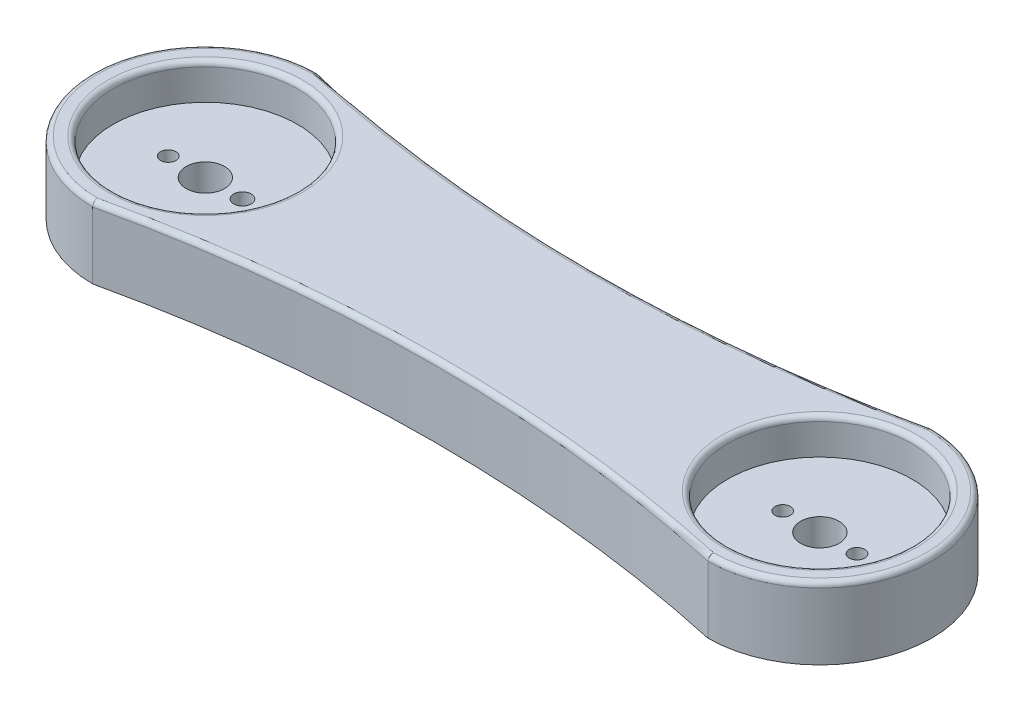
ISO-10303-21;
HEADER;
FILE_DESCRIPTION(('STEP AP214'),'2;1');
FILE_NAME('part.step','',(''),(''),'','','');
FILE_SCHEMA(('AUTOMOTIVE_DESIGN { 1 0 10303 214 1 1 1 1 }'));
ENDSEC;
DATA;
#1=APPLICATION_CONTEXT('core data for automotive mechanical design processes');
#2=APPLICATION_PROTOCOL_DEFINITION('international standard','automotive_design',2000,#1);
#3=PRODUCT_CONTEXT('',#1,'mechanical');
#4=PRODUCT('Part','Part','',(#3));
#5=PRODUCT_RELATED_PRODUCT_CATEGORY('part','',(#4));
#6=PRODUCT_DEFINITION_FORMATION('','',#4);
#7=PRODUCT_DEFINITION_CONTEXT('part definition',#1,'design');
#8=PRODUCT_DEFINITION('design','',#6,#7);
#9=PRODUCT_DEFINITION_SHAPE('','',#8);
#10=(LENGTH_UNIT() NAMED_UNIT(*) SI_UNIT(.MILLI.,.METRE.));
#11=(NAMED_UNIT(*) PLANE_ANGLE_UNIT() SI_UNIT($,.RADIAN.));
#12=(NAMED_UNIT(*) SI_UNIT($,.STERADIAN.) SOLID_ANGLE_UNIT());
#13=UNCERTAINTY_MEASURE_WITH_UNIT(LENGTH_MEASURE(1.E-05),#10,'distance_accuracy_value','');
#14=(GEOMETRIC_REPRESENTATION_CONTEXT(3) GLOBAL_UNCERTAINTY_ASSIGNED_CONTEXT((#13)) GLOBAL_UNIT_ASSIGNED_CONTEXT((#10,
#11,#12)) REPRESENTATION_CONTEXT('',''));
#15=CARTESIAN_POINT('',(0.,0.,0.));
#16=DIRECTION('',(0.,0.,1.));
#17=DIRECTION('',(1.,0.,0.));
#18=AXIS2_PLACEMENT_3D('',#15,#16,#17);
#19=CARTESIAN_POINT('',(-59.6374508906015,14.,-292.561880173553));
#20=DIRECTION('',(0.,-1.,0.));
#21=DIRECTION('',(0.,0.,-1.));
#22=AXIS2_PLACEMENT_3D('',#19,#20,#21);
#23=CYLINDRICAL_SURFACE('',#22,277.213578920717);
#24=DIRECTION('',(0.,-1.,0.));
#25=VECTOR('',#24,1.);
#26=CARTESIAN_POINT('',(-120.,14.,-22.));
#27=LINE('',#26,#25);
#28=CARTESIAN_POINT('',(-120.,13.,-22.));
#29=VERTEX_POINT('',#28);
#30=CARTESIAN_POINT('',(-120.,0.,-22.));
#31=VERTEX_POINT('',#30);
#32=EDGE_CURVE('E96',#29,#31,#27,.T.);
#33=ORIENTED_EDGE('',*,*,#32,.F.);
#34=CARTESIAN_POINT('',(-59.6374508906015,13.,-292.561880173553));
#35=DIRECTION('',(0.,-1.,0.));
#36=DIRECTION('',(0.,0.,-1.));
#37=AXIS2_PLACEMENT_3D('',#34,#35,#36);
#38=CIRCLE('',#37,277.213578920717);
#39=CARTESIAN_POINT('',(0.,13.,-21.8392494436791));
#40=VERTEX_POINT('',#39);
#41=EDGE_CURVE('E169',#29,#40,#38,.F.);
#42=ORIENTED_EDGE('',*,*,#41,.T.);
#43=DIRECTION('',(0.,-1.,0.));
#44=VECTOR('',#43,1.);
#45=CARTESIAN_POINT('',(0.,14.,-21.8392494436791));
#46=LINE('',#45,#44);
#47=CARTESIAN_POINT('',(0.,0.,-21.8392494436791));
#48=VERTEX_POINT('',#47);
#49=EDGE_CURVE('E118',#40,#48,#46,.T.);
#50=ORIENTED_EDGE('',*,*,#49,.T.);
#51=CARTESIAN_POINT('',(-59.6374508906015,0.,-292.561880173553));
#52=DIRECTION('',(0.,-1.,0.));
#53=DIRECTION('',(0.,0.,-1.));
#54=AXIS2_PLACEMENT_3D('',#51,#52,#53);
#55=CIRCLE('',#54,277.213578920717);
#56=EDGE_CURVE('E112',#48,#31,#55,.T.);
#57=ORIENTED_EDGE('',*,*,#56,.T.);
#58=EDGE_LOOP('',(#33,#42,#50,#57));
#59=FACE_BOUND('',#58,.T.);
#60=ADVANCED_FACE('F39',(#59),#23,.F.);
#61=CARTESIAN_POINT('',(-120.,14.,0.));
#62=DIRECTION('',(0.,-1.,0.));
#63=DIRECTION('',(0.,0.,-1.));
#64=AXIS2_PLACEMENT_3D('',#61,#62,#63);
#65=CYLINDRICAL_SURFACE('',#64,22.);
#66=DIRECTION('',(0.,-1.,0.));
#67=VECTOR('',#66,1.);
#68=CARTESIAN_POINT('',(-120.,14.,22.));
#69=LINE('',#68,#67);
#70=CARTESIAN_POINT('',(-120.,13.,22.));
#71=VERTEX_POINT('',#70);
#72=CARTESIAN_POINT('',(-120.,0.,22.));
#73=VERTEX_POINT('',#72);
#74=EDGE_CURVE('E106',#71,#73,#69,.T.);
#75=ORIENTED_EDGE('',*,*,#74,.F.);
#76=CARTESIAN_POINT('',(-120.,13.,0.));
#77=DIRECTION('',(0.,-1.,0.));
#78=DIRECTION('',(0.,0.,-1.));
#79=AXIS2_PLACEMENT_3D('',#76,#77,#78);
#80=CIRCLE('',#79,22.);
#81=EDGE_CURVE('E54',#71,#29,#80,.T.);
#82=ORIENTED_EDGE('',*,*,#81,.T.);
#83=ORIENTED_EDGE('',*,*,#32,.T.);
#84=CARTESIAN_POINT('',(-120.,0.,0.));
#85=DIRECTION('',(0.,1.,0.));
#86=DIRECTION('',(0.,0.,1.));
#87=AXIS2_PLACEMENT_3D('',#84,#85,#86);
#88=CIRCLE('',#87,22.);
#89=EDGE_CURVE('E99',#31,#73,#88,.T.);
#90=ORIENTED_EDGE('',*,*,#89,.T.);
#91=EDGE_LOOP('',(#75,#82,#83,#90));
#92=FACE_BOUND('',#91,.T.);
#93=ADVANCED_FACE('F98',(#92),#65,.T.);
#94=CARTESIAN_POINT('',(-59.6374505493174,14.,292.562134941562));
#95=DIRECTION('',(0.,-1.,0.));
#96=DIRECTION('',(0.,0.,-1.));
#97=AXIS2_PLACEMENT_3D('',#94,#95,#96);
#98=CYLINDRICAL_SURFACE('',#97,277.213827649925);
#99=DIRECTION('',(0.,-1.,0.));
#100=VECTOR('',#99,1.);
#101=CARTESIAN_POINT('',(0.,14.,21.8392494436791));
#102=LINE('',#101,#100);
#103=CARTESIAN_POINT('',(0.,13.,21.8392494436791));
#104=VERTEX_POINT('',#103);
#105=CARTESIAN_POINT('',(0.,0.,21.8392494436791));
#106=VERTEX_POINT('',#105);
#107=EDGE_CURVE('E136',#104,#106,#102,.T.);
#108=ORIENTED_EDGE('',*,*,#107,.F.);
#109=CARTESIAN_POINT('',(-59.6374505493174,13.,292.562134941562));
#110=DIRECTION('',(0.,-1.,0.));
#111=DIRECTION('',(0.,0.,-1.));
#112=AXIS2_PLACEMENT_3D('',#109,#110,#111);
#113=CIRCLE('',#112,277.213827649925);
#114=EDGE_CURVE('E11',#104,#71,#113,.F.);
#115=ORIENTED_EDGE('',*,*,#114,.T.);
#116=ORIENTED_EDGE('',*,*,#74,.T.);
#117=CARTESIAN_POINT('',(-59.6374505493174,0.,292.562134941562));
#118=DIRECTION('',(0.,-1.,0.));
#119=DIRECTION('',(0.,0.,1.));
#120=AXIS2_PLACEMENT_3D('',#117,#118,#119);
#121=CIRCLE('',#120,277.213827649925);
#122=EDGE_CURVE('E114',#73,#106,#121,.T.);
#123=ORIENTED_EDGE('',*,*,#122,.T.);
#124=EDGE_LOOP('',(#108,#115,#116,#123));
#125=FACE_BOUND('',#124,.T.);
#126=ADVANCED_FACE('F227',(#125),#98,.F.);
#127=CARTESIAN_POINT('',(0.,14.,0.));
#128=DIRECTION('',(0.,-1.,0.));
#129=DIRECTION('',(0.,0.,-1.));
#130=AXIS2_PLACEMENT_3D('',#127,#128,#129);
#131=CYLINDRICAL_SURFACE('',#130,21.8392494436791);
#132=ORIENTED_EDGE('',*,*,#49,.F.);
#133=CARTESIAN_POINT('',(0.,13.,0.));
#134=DIRECTION('',(0.,-1.,0.));
#135=DIRECTION('',(0.,0.,-1.));
#136=AXIS2_PLACEMENT_3D('',#133,#134,#135);
#137=CIRCLE('',#136,21.8392494436791);
#138=EDGE_CURVE('E165',#40,#104,#137,.T.);
#139=ORIENTED_EDGE('',*,*,#138,.T.);
#140=ORIENTED_EDGE('',*,*,#107,.T.);
#141=CARTESIAN_POINT('',(0.,0.,0.));
#142=DIRECTION('',(0.,1.,0.));
#143=DIRECTION('',(0.,0.,1.));
#144=AXIS2_PLACEMENT_3D('',#141,#142,#143);
#145=CIRCLE('',#144,21.8392494436791);
#146=EDGE_CURVE('E131',#106,#48,#145,.T.);
#147=ORIENTED_EDGE('',*,*,#146,.T.);
#148=EDGE_LOOP('',(#132,#139,#140,#147));
#149=FACE_BOUND('',#148,.T.);
#150=ADVANCED_FACE('F232',(#149),#131,.T.);
#151=CARTESIAN_POINT('',(-89.8187254453008,14.,-146.280940086777));
#152=DIRECTION('',(0.,-1.,0.));
#153=DIRECTION('',(0.,0.,-1.));
#154=AXIS2_PLACEMENT_3D('',#151,#152,#153);
#155=PLANE('',#154);
#156=CARTESIAN_POINT('',(0.,14.,0.));
#157=DIRECTION('',(0.,-1.,0.));
#158=DIRECTION('',(0.,0.,-1.));
#159=AXIS2_PLACEMENT_3D('',#156,#157,#158);
#160=CIRCLE('',#159,19.);
#161=CARTESIAN_POINT('',(0.,14.,-19.));
#162=VERTEX_POINT('',#161);
#163=EDGE_CURVE('E161',#162,#162,#160,.T.);
#164=ORIENTED_EDGE('',*,*,#163,.T.);
#165=EDGE_LOOP('',(#164));
#166=FACE_BOUND('',#165,.T.);
#167=CARTESIAN_POINT('',(-120.,14.,0.));
#168=DIRECTION('',(0.,-1.,0.));
#169=DIRECTION('',(0.,0.,-1.));
#170=AXIS2_PLACEMENT_3D('',#167,#168,#169);
#171=CIRCLE('',#170,19.);
#172=CARTESIAN_POINT('',(-120.,14.,-19.));
#173=VERTEX_POINT('',#172);
#174=EDGE_CURVE('E157',#173,#173,#171,.T.);
#175=ORIENTED_EDGE('',*,*,#174,.T.);
#176=EDGE_LOOP('',(#175));
#177=FACE_BOUND('',#176,.T.);
#178=CARTESIAN_POINT('',(-59.6374505493174,14.,292.562134941562));
#179=DIRECTION('',(0.,-1.,0.));
#180=DIRECTION('',(0.,0.,-1.));
#181=AXIS2_PLACEMENT_3D('',#178,#179,#180);
#182=CIRCLE('',#181,278.213827649925);
#183=CARTESIAN_POINT('',(-120.108828926809,14.,20.9997180044088));
#184=VERTEX_POINT('',#183);
#185=CARTESIAN_POINT('',(0.10748031950056,14.,20.8389722720867));
#186=VERTEX_POINT('',#185);
#187=EDGE_CURVE('E144',#184,#186,#182,.T.);
#188=ORIENTED_EDGE('',*,*,#187,.T.);
#189=CARTESIAN_POINT('',(0.,14.,0.));
#190=DIRECTION('',(0.,-1.,0.));
#191=DIRECTION('',(0.,0.,-1.));
#192=AXIS2_PLACEMENT_3D('',#189,#190,#191);
#193=CIRCLE('',#192,20.8392494436791);
#194=CARTESIAN_POINT('',(0.107480418815562,14.,-20.8389722715745));
#195=VERTEX_POINT('',#194);
#196=EDGE_CURVE('E153',#186,#195,#193,.F.);
#197=ORIENTED_EDGE('',*,*,#196,.T.);
#198=CARTESIAN_POINT('',(-59.6374508906015,14.,-292.561880173553));
#199=DIRECTION('',(0.,-1.,0.));
#200=DIRECTION('',(0.,0.,-1.));
#201=AXIS2_PLACEMENT_3D('',#198,#199,#200);
#202=CIRCLE('',#201,278.213578920717);
#203=CARTESIAN_POINT('',(-120.108829026161,14.,-20.9997180038939));
#204=VERTEX_POINT('',#203);
#205=EDGE_CURVE('E150',#195,#204,#202,.T.);
#206=ORIENTED_EDGE('',*,*,#205,.T.);
#207=CARTESIAN_POINT('',(-120.,14.,0.));
#208=DIRECTION('',(0.,-1.,0.));
#209=DIRECTION('',(0.,0.,-1.));
#210=AXIS2_PLACEMENT_3D('',#207,#208,#209);
#211=CIRCLE('',#210,21.);
#212=EDGE_CURVE('E147',#204,#184,#211,.F.);
#213=ORIENTED_EDGE('',*,*,#212,.T.);
#214=EDGE_LOOP('',(#188,#197,#206,#213));
#215=FACE_BOUND('',#214,.T.);
#216=ADVANCED_FACE('F235',(#166,#177,#215),#155,.F.);
#217=CARTESIAN_POINT('',(-89.8187254453008,0.,-146.280940086777));
#218=DIRECTION('',(0.,-1.,0.));
#219=DIRECTION('',(0.,0.,-1.));
#220=AXIS2_PLACEMENT_3D('',#217,#218,#219);
#221=PLANE('',#220);
#222=CARTESIAN_POINT('',(-7.25,0.,0.));
#223=DIRECTION('',(0.,1.,0.));
#224=DIRECTION('',(0.,0.,1.));
#225=AXIS2_PLACEMENT_3D('',#222,#223,#224);
#226=CIRCLE('',#225,1.5);
#227=CARTESIAN_POINT('',(-7.25,0.,1.5));
#228=VERTEX_POINT('',#227);
#229=EDGE_CURVE('E292',#228,#228,#226,.T.);
#230=ORIENTED_EDGE('',*,*,#229,.T.);
#231=EDGE_LOOP('',(#230));
#232=FACE_BOUND('',#231,.T.);
#233=CARTESIAN_POINT('',(7.25,0.,0.));
#234=DIRECTION('',(0.,1.,0.));
#235=DIRECTION('',(0.,0.,1.));
#236=AXIS2_PLACEMENT_3D('',#233,#234,#235);
#237=CIRCLE('',#236,1.5);
#238=CARTESIAN_POINT('',(7.25,0.,1.5));
#239=VERTEX_POINT('',#238);
#240=EDGE_CURVE('E286',#239,#239,#237,.T.);
#241=ORIENTED_EDGE('',*,*,#240,.T.);
#242=EDGE_LOOP('',(#241));
#243=FACE_BOUND('',#242,.T.);
#244=CARTESIAN_POINT('',(0.,0.,0.));
#245=DIRECTION('',(0.,1.,0.));
#246=DIRECTION('',(0.,0.,1.));
#247=AXIS2_PLACEMENT_3D('',#244,#245,#246);
#248=CIRCLE('',#247,3.75);
#249=CARTESIAN_POINT('',(0.,0.,3.75));
#250=VERTEX_POINT('',#249);
#251=EDGE_CURVE('E305',#250,#250,#248,.T.);
#252=ORIENTED_EDGE('',*,*,#251,.T.);
#253=EDGE_LOOP('',(#252));
#254=FACE_BOUND('',#253,.T.);
#255=CARTESIAN_POINT('',(-112.75,0.,0.));
#256=DIRECTION('',(0.,1.,0.));
#257=DIRECTION('',(0.,0.,1.));
#258=AXIS2_PLACEMENT_3D('',#255,#256,#257);
#259=CIRCLE('',#258,1.70242679062383);
#260=CARTESIAN_POINT('',(-112.75,0.,1.70242679062383));
#261=VERTEX_POINT('',#260);
#262=EDGE_CURVE('E322',#261,#261,#259,.T.);
#263=ORIENTED_EDGE('',*,*,#262,.T.);
#264=EDGE_LOOP('',(#263));
#265=FACE_BOUND('',#264,.T.);
#266=CARTESIAN_POINT('',(-127.25,0.,0.));
#267=DIRECTION('',(0.,1.,0.));
#268=DIRECTION('',(0.,0.,1.));
#269=AXIS2_PLACEMENT_3D('',#266,#267,#268);
#270=CIRCLE('',#269,1.5);
#271=CARTESIAN_POINT('',(-127.25,0.,1.5));
#272=VERTEX_POINT('',#271);
#273=EDGE_CURVE('E313',#272,#272,#270,.T.);
#274=ORIENTED_EDGE('',*,*,#273,.T.);
#275=EDGE_LOOP('',(#274));
#276=FACE_BOUND('',#275,.T.);
#277=CARTESIAN_POINT('',(-120.,0.,0.));
#278=DIRECTION('',(0.,1.,0.));
#279=DIRECTION('',(0.,0.,1.));
#280=AXIS2_PLACEMENT_3D('',#277,#278,#279);
#281=CIRCLE('',#280,3.75000000000001);
#282=CARTESIAN_POINT('',(-120.,0.,3.75000000000001));
#283=VERTEX_POINT('',#282);
#284=EDGE_CURVE('E329',#283,#283,#281,.T.);
#285=ORIENTED_EDGE('',*,*,#284,.T.);
#286=EDGE_LOOP('',(#285));
#287=FACE_BOUND('',#286,.T.);
#288=ORIENTED_EDGE('',*,*,#56,.F.);
#289=ORIENTED_EDGE('',*,*,#146,.F.);
#290=ORIENTED_EDGE('',*,*,#122,.F.);
#291=ORIENTED_EDGE('',*,*,#89,.F.);
#292=EDGE_LOOP('',(#288,#289,#290,#291));
#293=FACE_BOUND('',#292,.T.);
#294=ADVANCED_FACE('F110',(#232,#243,#254,#265,#276,#287,#293),#221,.T.);
#295=CARTESIAN_POINT('',(0.,7.,0.));
#296=DIRECTION('',(0.,1.,0.));
#297=DIRECTION('',(0.,0.,1.));
#298=AXIS2_PLACEMENT_3D('',#295,#296,#297);
#299=CYLINDRICAL_SURFACE('',#298,18.);
#300=CARTESIAN_POINT('',(0.,13.,0.));
#301=DIRECTION('',(0.,-1.,0.));
#302=DIRECTION('',(0.,0.,-1.));
#303=AXIS2_PLACEMENT_3D('',#300,#301,#302);
#304=CIRCLE('',#303,18.);
#305=CARTESIAN_POINT('',(0.,13.,-18.));
#306=VERTEX_POINT('',#305);
#307=EDGE_CURVE('E105',#306,#306,#304,.F.);
#308=ORIENTED_EDGE('',*,*,#307,.T.);
#309=EDGE_LOOP('',(#308));
#310=FACE_BOUND('',#309,.T.);
#311=CARTESIAN_POINT('',(0.,7.,0.));
#312=DIRECTION('',(0.,1.,0.));
#313=DIRECTION('',(0.,0.,1.));
#314=AXIS2_PLACEMENT_3D('',#311,#312,#313);
#315=CIRCLE('',#314,18.);
#316=CARTESIAN_POINT('',(0.,7.,18.));
#317=VERTEX_POINT('',#316);
#318=EDGE_CURVE('E125',#317,#317,#315,.T.);
#319=ORIENTED_EDGE('',*,*,#318,.F.);
#320=EDGE_LOOP('',(#319));
#321=FACE_BOUND('',#320,.T.);
#322=ADVANCED_FACE('F239',(#310,#321),#299,.F.);
#323=CARTESIAN_POINT('',(0.,7.,0.));
#324=DIRECTION('',(0.,1.,0.));
#325=DIRECTION('',(0.,0.,1.));
#326=AXIS2_PLACEMENT_3D('',#323,#324,#325);
#327=PLANE('',#326);
#328=CARTESIAN_POINT('',(0.,7.,0.));
#329=DIRECTION('',(0.,1.,0.));
#330=DIRECTION('',(0.,0.,1.));
#331=AXIS2_PLACEMENT_3D('',#328,#329,#330);
#332=CIRCLE('',#331,3.75);
#333=CARTESIAN_POINT('',(0.,7.,3.75));
#334=VERTEX_POINT('',#333);
#335=EDGE_CURVE('E296',#334,#334,#332,.T.);
#336=ORIENTED_EDGE('',*,*,#335,.F.);
#337=EDGE_LOOP('',(#336));
#338=FACE_BOUND('',#337,.T.);
#339=CARTESIAN_POINT('',(-7.25,7.,0.));
#340=DIRECTION('',(0.,1.,0.));
#341=DIRECTION('',(0.,0.,1.));
#342=AXIS2_PLACEMENT_3D('',#339,#340,#341);
#343=CIRCLE('',#342,1.5);
#344=CARTESIAN_POINT('',(-7.25,7.,1.5));
#345=VERTEX_POINT('',#344);
#346=EDGE_CURVE('E299',#345,#345,#343,.T.);
#347=ORIENTED_EDGE('',*,*,#346,.F.);
#348=EDGE_LOOP('',(#347));
#349=FACE_BOUND('',#348,.T.);
#350=CARTESIAN_POINT('',(7.25,7.,0.));
#351=DIRECTION('',(0.,1.,0.));
#352=DIRECTION('',(0.,0.,1.));
#353=AXIS2_PLACEMENT_3D('',#350,#351,#352);
#354=CIRCLE('',#353,1.5);
#355=CARTESIAN_POINT('',(7.25,7.,1.5));
#356=VERTEX_POINT('',#355);
#357=EDGE_CURVE('E289',#356,#356,#354,.T.);
#358=ORIENTED_EDGE('',*,*,#357,.F.);
#359=EDGE_LOOP('',(#358));
#360=FACE_BOUND('',#359,.T.);
#361=ORIENTED_EDGE('',*,*,#318,.T.);
#362=EDGE_LOOP('',(#361));
#363=FACE_BOUND('',#362,.T.);
#364=ADVANCED_FACE('F246',(#338,#349,#360,#363),#327,.T.);
#365=CARTESIAN_POINT('',(-120.,7.,0.));
#366=DIRECTION('',(0.,1.,0.));
#367=DIRECTION('',(0.,0.,1.));
#368=AXIS2_PLACEMENT_3D('',#365,#366,#367);
#369=CYLINDRICAL_SURFACE('',#368,18.);
#370=CARTESIAN_POINT('',(-120.,13.,0.));
#371=DIRECTION('',(0.,-1.,0.));
#372=DIRECTION('',(0.,0.,-1.));
#373=AXIS2_PLACEMENT_3D('',#370,#371,#372);
#374=CIRCLE('',#373,18.);
#375=CARTESIAN_POINT('',(-120.,13.,-18.));
#376=VERTEX_POINT('',#375);
#377=EDGE_CURVE('E172',#376,#376,#374,.F.);
#378=ORIENTED_EDGE('',*,*,#377,.T.);
#379=EDGE_LOOP('',(#378));
#380=FACE_BOUND('',#379,.T.);
#381=CARTESIAN_POINT('',(-120.,7.,0.));
#382=DIRECTION('',(0.,1.,0.));
#383=DIRECTION('',(0.,0.,1.));
#384=AXIS2_PLACEMENT_3D('',#381,#382,#383);
#385=CIRCLE('',#384,18.);
#386=CARTESIAN_POINT('',(-120.,7.,18.));
#387=VERTEX_POINT('',#386);
#388=EDGE_CURVE('E121',#387,#387,#385,.T.);
#389=ORIENTED_EDGE('',*,*,#388,.F.);
#390=EDGE_LOOP('',(#389));
#391=FACE_BOUND('',#390,.T.);
#392=ADVANCED_FACE('F250',(#380,#391),#369,.F.);
#393=CARTESIAN_POINT('',(-120.,7.,0.));
#394=DIRECTION('',(0.,1.,0.));
#395=DIRECTION('',(0.,0.,1.));
#396=AXIS2_PLACEMENT_3D('',#393,#394,#395);
#397=PLANE('',#396);
#398=CARTESIAN_POINT('',(-120.,7.,0.));
#399=DIRECTION('',(0.,1.,0.));
#400=DIRECTION('',(0.,0.,1.));
#401=AXIS2_PLACEMENT_3D('',#398,#399,#400);
#402=CIRCLE('',#401,3.75000000000001);
#403=CARTESIAN_POINT('',(-120.,7.,3.75000000000001));
#404=VERTEX_POINT('',#403);
#405=EDGE_CURVE('E317',#404,#404,#402,.T.);
#406=ORIENTED_EDGE('',*,*,#405,.F.);
#407=EDGE_LOOP('',(#406));
#408=FACE_BOUND('',#407,.T.);
#409=CARTESIAN_POINT('',(-112.75,7.,0.));
#410=DIRECTION('',(0.,1.,0.));
#411=DIRECTION('',(0.,0.,1.));
#412=AXIS2_PLACEMENT_3D('',#409,#410,#411);
#413=CIRCLE('',#412,1.70242679062383);
#414=CARTESIAN_POINT('',(-112.75,7.,1.70242679062383));
#415=VERTEX_POINT('',#414);
#416=EDGE_CURVE('E309',#415,#415,#413,.T.);
#417=ORIENTED_EDGE('',*,*,#416,.F.);
#418=EDGE_LOOP('',(#417));
#419=FACE_BOUND('',#418,.T.);
#420=CARTESIAN_POINT('',(-127.25,7.,0.));
#421=DIRECTION('',(0.,1.,0.));
#422=DIRECTION('',(0.,0.,1.));
#423=AXIS2_PLACEMENT_3D('',#420,#421,#422);
#424=CIRCLE('',#423,1.5);
#425=CARTESIAN_POINT('',(-127.25,7.,1.5));
#426=VERTEX_POINT('',#425);
#427=EDGE_CURVE('E318',#426,#426,#424,.T.);
#428=ORIENTED_EDGE('',*,*,#427,.F.);
#429=EDGE_LOOP('',(#428));
#430=FACE_BOUND('',#429,.T.);
#431=ORIENTED_EDGE('',*,*,#388,.T.);
#432=EDGE_LOOP('',(#431));
#433=FACE_BOUND('',#432,.T.);
#434=ADVANCED_FACE('F254',(#408,#419,#430,#433),#397,.T.);
#435=CARTESIAN_POINT('',(-127.25,0.,0.));
#436=DIRECTION('',(0.,1.,0.));
#437=DIRECTION('',(0.,0.,1.));
#438=AXIS2_PLACEMENT_3D('',#435,#436,#437);
#439=CYLINDRICAL_SURFACE('',#438,1.5);
#440=ORIENTED_EDGE('',*,*,#273,.F.);
#441=EDGE_LOOP('',(#440));
#442=FACE_BOUND('',#441,.T.);
#443=ORIENTED_EDGE('',*,*,#427,.T.);
#444=EDGE_LOOP('',(#443));
#445=FACE_BOUND('',#444,.T.);
#446=ADVANCED_FACE('F258',(#442,#445),#439,.F.);
#447=CARTESIAN_POINT('',(-112.75,0.,0.));
#448=DIRECTION('',(0.,1.,0.));
#449=DIRECTION('',(0.,0.,1.));
#450=AXIS2_PLACEMENT_3D('',#447,#448,#449);
#451=CYLINDRICAL_SURFACE('',#450,1.70242679062383);
#452=ORIENTED_EDGE('',*,*,#262,.F.);
#453=EDGE_LOOP('',(#452));
#454=FACE_BOUND('',#453,.T.);
#455=ORIENTED_EDGE('',*,*,#416,.T.);
#456=EDGE_LOOP('',(#455));
#457=FACE_BOUND('',#456,.T.);
#458=ADVANCED_FACE('F264',(#454,#457),#451,.F.);
#459=CARTESIAN_POINT('',(-120.,0.,0.));
#460=DIRECTION('',(0.,1.,0.));
#461=DIRECTION('',(0.,0.,1.));
#462=AXIS2_PLACEMENT_3D('',#459,#460,#461);
#463=CYLINDRICAL_SURFACE('',#462,3.75000000000001);
#464=ORIENTED_EDGE('',*,*,#284,.F.);
#465=EDGE_LOOP('',(#464));
#466=FACE_BOUND('',#465,.T.);
#467=ORIENTED_EDGE('',*,*,#405,.T.);
#468=EDGE_LOOP('',(#467));
#469=FACE_BOUND('',#468,.T.);
#470=ADVANCED_FACE('F260',(#466,#469),#463,.F.);
#471=CARTESIAN_POINT('',(7.25,0.,0.));
#472=DIRECTION('',(0.,1.,0.));
#473=DIRECTION('',(0.,0.,1.));
#474=AXIS2_PLACEMENT_3D('',#471,#472,#473);
#475=CYLINDRICAL_SURFACE('',#474,1.5);
#476=ORIENTED_EDGE('',*,*,#240,.F.);
#477=EDGE_LOOP('',(#476));
#478=FACE_BOUND('',#477,.T.);
#479=ORIENTED_EDGE('',*,*,#357,.T.);
#480=EDGE_LOOP('',(#479));
#481=FACE_BOUND('',#480,.T.);
#482=ADVANCED_FACE('F263',(#478,#481),#475,.F.);
#483=CARTESIAN_POINT('',(-7.25,0.,0.));
#484=DIRECTION('',(0.,1.,0.));
#485=DIRECTION('',(0.,0.,1.));
#486=AXIS2_PLACEMENT_3D('',#483,#484,#485);
#487=CYLINDRICAL_SURFACE('',#486,1.5);
#488=ORIENTED_EDGE('',*,*,#229,.F.);
#489=EDGE_LOOP('',(#488));
#490=FACE_BOUND('',#489,.T.);
#491=ORIENTED_EDGE('',*,*,#346,.T.);
#492=EDGE_LOOP('',(#491));
#493=FACE_BOUND('',#492,.T.);
#494=ADVANCED_FACE('F274',(#490,#493),#487,.F.);
#495=CARTESIAN_POINT('',(0.,0.,0.));
#496=DIRECTION('',(0.,1.,0.));
#497=DIRECTION('',(0.,0.,1.));
#498=AXIS2_PLACEMENT_3D('',#495,#496,#497);
#499=CYLINDRICAL_SURFACE('',#498,3.75);
#500=ORIENTED_EDGE('',*,*,#251,.F.);
#501=EDGE_LOOP('',(#500));
#502=FACE_BOUND('',#501,.T.);
#503=ORIENTED_EDGE('',*,*,#335,.T.);
#504=EDGE_LOOP('',(#503));
#505=FACE_BOUND('',#504,.T.);
#506=ADVANCED_FACE('F220',(#502,#505),#499,.F.);
#507=CARTESIAN_POINT('',(0.,13.,0.));
#508=DIRECTION('',(0.,-1.,0.));
#509=DIRECTION('',(0.,0.,-1.));
#510=AXIS2_PLACEMENT_3D('',#507,#508,#509);
#511=TOROIDAL_SURFACE('',#510,19.,1.);
#512=ORIENTED_EDGE('',*,*,#163,.F.);
#513=EDGE_LOOP('',(#512));
#514=FACE_BOUND('',#513,.T.);
#515=ORIENTED_EDGE('',*,*,#307,.F.);
#516=EDGE_LOOP('',(#515));
#517=FACE_BOUND('',#516,.T.);
#518=ADVANCED_FACE('F212',(#514,#517),#511,.T.);
#519=CARTESIAN_POINT('',(-120.,13.,0.));
#520=DIRECTION('',(0.,-1.,0.));
#521=DIRECTION('',(0.,0.,-1.));
#522=AXIS2_PLACEMENT_3D('',#519,#520,#521);
#523=TOROIDAL_SURFACE('',#522,21.,1.);
#524=CARTESIAN_POINT('',(-120.,13.,-22.));
#525=CARTESIAN_POINT('',(-119.999999992669,13.0280100744811,-21.9999998989799));
#526=CARTESIAN_POINT('',(-120.000129767721,13.0560066871765,-21.9988224077833));
#527=CARTESIAN_POINT('',(-120.000647309818,13.111798659349,-21.9941254937511));
#528=CARTESIAN_POINT('',(-120.001035061478,13.1395940307283,-21.990606210581));
#529=CARTESIAN_POINT('',(-120.002581139866,13.2223252047846,-21.9765711265597));
#530=CARTESIAN_POINT('',(-120.004122302503,13.2767053093904,-21.9625779871342));
#531=CARTESIAN_POINT('',(-120.008178186036,13.3823259483589,-21.9257205315833));
#532=CARTESIAN_POINT('',(-120.010693314246,13.4335651588001,-21.9028525039666));
#533=CARTESIAN_POINT('',(-120.016618684787,13.5314650391127,-21.8489142759279));
#534=CARTESIAN_POINT('',(-120.020028759968,13.5781265617282,-21.8178456071384));
#535=CARTESIAN_POINT('',(-120.02764957964,13.6656862458729,-21.7483114744114));
#536=CARTESIAN_POINT('',(-120.031862361292,13.7065692723083,-21.7098271877597));
#537=CARTESIAN_POINT('',(-120.040957208881,13.781313994956,-21.6266008322268));
#538=CARTESIAN_POINT('',(-120.045839499451,13.8151733249446,-21.5818566629172));
#539=CARTESIAN_POINT('',(-120.056157420414,13.875106315563,-21.4871132346009));
#540=CARTESIAN_POINT('',(-120.061596174993,13.9011323756857,-21.4370842474231));
#541=CARTESIAN_POINT('',(-120.072841378288,13.9444006748518,-21.3334234626747));
#542=CARTESIAN_POINT('',(-120.078647541968,13.9616496314718,-21.2797944560804));
#543=CARTESIAN_POINT('',(-120.08830909902,13.9823308299657,-21.190355318359));
#544=CARTESIAN_POINT('',(-120.092107327885,13.9885057880401,-21.1551456437249));
#545=CARTESIAN_POINT('',(-120.099737937603,13.9970554082015,-21.0843077229753));
#546=CARTESIAN_POINT('',(-120.103570254326,13.9994361156593,-21.0486802340005));
#547=CARTESIAN_POINT('',(-120.107874496479,13.9999704677244,-21.0086072156643));
#548=CARTESIAN_POINT('',(-120.108351828867,14.0000000779001,-21.0041623861088));
#549=CARTESIAN_POINT('',(-120.108829026161,14.,-20.9997180038939));
#550=B_SPLINE_CURVE_WITH_KNOTS('',3,(#524,#525,#526,#527,#528,#529,#530,#531,#532,#533,#534,
#535,#536,#537,#538,#539,#540,#541,#542,#543,#544,#545,#546,#547,#548,#549),.UNSPECIFIED.,.F.,
.F.,(4,2,2,2,2,2,2,2,2,2,2,2,4),(0.,0.0839784653931065,0.167951922719227,0.335604911211167,
0.503328088113528,0.671019961525235,0.839143223753665,1.00732303361971,1.17650509616808,
1.34555747933594,1.45322729743761,1.56072539334331,1.57413638594396),.UNSPECIFIED.);
#551=EDGE_CURVE('E202',#29,#204,#550,.T.);
#552=ORIENTED_EDGE('',*,*,#551,.F.);
#553=ORIENTED_EDGE('',*,*,#81,.F.);
#554=CARTESIAN_POINT('',(-120.,13.,22.));
#555=CARTESIAN_POINT('',(-119.999999992669,13.0280100747049,21.9999998989797));
#556=CARTESIAN_POINT('',(-120.000129767604,13.0560066876241,21.9988224077645));
#557=CARTESIAN_POINT('',(-120.000647309237,13.1117986602442,21.9941254936569));
#558=CARTESIAN_POINT('',(-120.001035060549,13.1395940318473,21.99060621043));
#559=CARTESIAN_POINT('',(-120.00258113755,13.2223252065898,21.9765711261766));
#560=CARTESIAN_POINT('',(-120.004122298805,13.276705311656,21.9625779865144));
#561=CARTESIAN_POINT('',(-120.008178178705,13.3823259515291,21.9257205303091));
#562=CARTESIAN_POINT('',(-120.010693304664,13.4335651624141,21.9028525022736));
#563=CARTESIAN_POINT('',(-120.016618669907,13.5314650435514,21.8489142732001));
#564=CARTESIAN_POINT('',(-120.020028742041,13.5781265665481,21.8178456037952));
#565=CARTESIAN_POINT('',(-120.027649554894,13.6656862511343,21.7483114697949));
#566=CARTESIAN_POINT('',(-120.031862332768,13.7065692776578,21.7098271825194));
#567=CARTESIAN_POINT('',(-120.040957172206,13.7813140003665,21.6266008255979));
#568=CARTESIAN_POINT('',(-120.045839458403,13.8151733303281,21.5818566555236));
#569=CARTESIAN_POINT('',(-120.056157370075,13.8751063204023,21.4871132260481));
#570=CARTESIAN_POINT('',(-120.061596119728,13.901132380089,21.4370842385265));
#571=CARTESIAN_POINT('',(-120.072841312836,13.9444006783195,21.333423453103));
#572=CARTESIAN_POINT('',(-120.078647471256,13.9616496344422,21.2797944461784));
#573=CARTESIAN_POINT('',(-120.088309019237,13.9823308313825,21.1903553108553));
#574=CARTESIAN_POINT('',(-120.092107244338,13.9885057887377,21.1551456390015));
#575=CARTESIAN_POINT('',(-120.099737846494,13.9970554080611,21.0843077238796));
#576=CARTESIAN_POINT('',(-120.103570159418,13.9994361153988,21.048680237752));
#577=CARTESIAN_POINT('',(-120.107874397562,13.9999704676974,21.0086072202252));
#578=CARTESIAN_POINT('',(-120.108351729732,14.0000000779002,21.0041623886465));
#579=CARTESIAN_POINT('',(-120.108828926809,14.,20.9997180044088));
#580=B_SPLINE_CURVE_WITH_KNOTS('',3,(#554,#555,#556,#557,#558,#559,#560,#561,#562,#563,#564,
#565,#566,#567,#568,#569,#570,#571,#572,#573,#574,#575,#576,#577,#578,#579),.UNSPECIFIED.,.F.,
.F.,(4,2,2,2,2,2,2,2,2,2,2,2,4),(0.,0.0839784660643416,0.167951924063463,0.335604913950104,
0.503328092265551,0.671019967074645,0.839143229911598,1.00732304038771,1.17650510182246,
1.34555748383363,1.45322729224546,1.56072537849313,1.5741363770587),.UNSPECIFIED.);
#581=EDGE_CURVE('E43',#184,#71,#580,.F.);
#582=ORIENTED_EDGE('',*,*,#581,.F.);
#583=ORIENTED_EDGE('',*,*,#212,.F.);
#584=EDGE_LOOP('',(#552,#553,#582,#583));
#585=FACE_BOUND('',#584,.T.);
#586=ADVANCED_FACE('F209',(#585),#523,.T.);
#587=CARTESIAN_POINT('',(-59.6374505493174,13.,292.562134941562));
#588=DIRECTION('',(0.,-1.,0.));
#589=DIRECTION('',(0.,0.,-1.));
#590=AXIS2_PLACEMENT_3D('',#587,#588,#589);
#591=TOROIDAL_SURFACE('',#590,278.213827649925,1.);
#592=ORIENTED_EDGE('',*,*,#581,.T.);
#593=ORIENTED_EDGE('',*,*,#114,.F.);
#594=CARTESIAN_POINT('',(0.,13.,21.8392494436791));
#595=CARTESIAN_POINT('',(-7.13659848519394E-09,13.0280130654566,21.839249340542));
#596=CARTESIAN_POINT('',(0.000128198537886458,13.0560126687267,21.838071600135));
#597=CARTESIAN_POINT('',(0.000639482720950815,13.1118106233858,21.8333736777814));
#598=CARTESIAN_POINT('',(0.00102254610313931,13.1396089866198,21.8298536348559));
#599=CARTESIAN_POINT('',(0.002549936884094,13.2223493327067,21.8158154484639));
#600=CARTESIAN_POINT('',(0.0040724772269832,13.276735592741,21.8018191436921));
#601=CARTESIAN_POINT('',(0.00807937470590087,13.3823683265668,21.7649529303695));
#602=CARTESIAN_POINT('',(0.0105641356144463,13.4336134717955,21.7420792966543));
#603=CARTESIAN_POINT('',(0.0164179859894211,13.5315243758918,21.6881272065098));
#604=CARTESIAN_POINT('',(0.0197869092232727,13.5781909933112,21.6570502923843));
#605=CARTESIAN_POINT('',(0.0273155357149458,13.6657565600768,21.5874990929838));
#606=CARTESIAN_POINT('',(0.0314772018294097,13.7066407445954,21.5490064433623));
#607=CARTESIAN_POINT('',(0.0404616470905791,13.7813862477529,21.4657614652312));
#608=CARTESIAN_POINT('',(0.0452846481970428,13.8152451989273,21.4210070350159));
#609=CARTESIAN_POINT('',(0.0554764696099342,13.8751708812522,21.3262480215541));
#610=CARTESIAN_POINT('',(0.0608483042036414,13.9011910983115,21.2762143888329));
#611=CARTESIAN_POINT('',(0.0719549248329879,13.9444468744526,21.1725444610118));
#612=CARTESIAN_POINT('',(0.0776894282246268,13.9616891819739,21.1189109694924));
#613=CARTESIAN_POINT('',(0.0872273962164475,13.9823496640951,21.0295036535688));
#614=CARTESIAN_POINT('',(0.0909744000367572,13.9885150361962,20.9943309801003));
#615=CARTESIAN_POINT('',(0.098501986059495,13.9970535001569,20.9235679445997));
#616=CARTESIAN_POINT('',(0.102282505269376,13.9994326169432,20.887978337127));
#617=CARTESIAN_POINT('',(0.106531938274594,13.9999701048886,20.8479158267022));
#618=CARTESIAN_POINT('',(0.107006196708376,14.0000000788694,20.8434438231368));
#619=CARTESIAN_POINT('',(0.10748031950056,14.,20.8389722720867));
#620=B_SPLINE_CURVE_WITH_KNOTS('',3,(#594,#595,#596,#597,#598,#599,#600,#601,#602,#603,#604,
#605,#606,#607,#608,#609,#610,#611,#612,#613,#614,#615,#616,#617,#618,#619),.UNSPECIFIED.,.F.,
.F.,(4,2,2,2,2,2,2,2,2,2,2,2,4),(0.,0.0839874363556239,0.167969888308438,0.3356415209671,
0.503383589334152,0.671094142848375,0.839225481536038,1.00741338785251,1.17658048650161,
1.34561733266888,1.45315792222322,1.56052721473019,1.57401828742236),.UNSPECIFIED.);
#621=EDGE_CURVE('E187',#186,#104,#620,.F.);
#622=ORIENTED_EDGE('',*,*,#621,.F.);
#623=ORIENTED_EDGE('',*,*,#187,.F.);
#624=EDGE_LOOP('',(#592,#593,#622,#623));
#625=FACE_BOUND('',#624,.T.);
#626=ADVANCED_FACE('F198',(#625),#591,.T.);
#627=CARTESIAN_POINT('',(-59.6374508906015,13.,-292.561880173553));
#628=DIRECTION('',(0.,-1.,0.));
#629=DIRECTION('',(0.,0.,-1.));
#630=AXIS2_PLACEMENT_3D('',#627,#628,#629);
#631=TOROIDAL_SURFACE('',#630,278.213578920717,1.);
#632=ORIENTED_EDGE('',*,*,#551,.T.);
#633=ORIENTED_EDGE('',*,*,#205,.F.);
#634=CARTESIAN_POINT('',(0.,13.,-21.839249443679));
#635=CARTESIAN_POINT('',(-7.13670872291266E-09,13.0280130652355,-21.8392493405421));
#636=CARTESIAN_POINT('',(0.000128198654416997,13.0560126682846,-21.8380716001535));
#637=CARTESIAN_POINT('',(0.000639483302381087,13.1118106225014,-21.8333736778745));
#638=CARTESIAN_POINT('',(0.00102254703280942,13.1396089855143,-21.8298536350052));
#639=CARTESIAN_POINT('',(0.00254993920111856,13.2223493309233,-21.8158154488425));
#640=CARTESIAN_POINT('',(0.0040724809257739,13.2767355905027,-21.8018191443044));
#641=CARTESIAN_POINT('',(0.00807938203874862,13.3823683234349,-21.7649529316285));
#642=CARTESIAN_POINT('',(0.0105641451998498,13.4336134682251,-21.742079298327));
#643=CARTESIAN_POINT('',(0.0164180008753546,13.5315243715067,-21.6881272092051));
#644=CARTESIAN_POINT('',(0.0197869271571117,13.5781909885496,-21.6570502956875));
#645=CARTESIAN_POINT('',(0.0273155604709976,13.6657565548791,-21.587499097545));
#646=CARTESIAN_POINT('',(0.0314772303651855,13.7066407393108,-21.5490064485399));
#647=CARTESIAN_POINT('',(0.040461683780498,13.7813862424082,-21.4657614717805));
#648=CARTESIAN_POINT('',(0.0452846892615749,13.8152451936094,-21.4210070423206));
#649=CARTESIAN_POINT('',(0.0554765199664104,13.8751708764722,-21.3262480300038));
#650=CARTESIAN_POINT('',(0.0608483594854275,13.9011910939623,-21.276214397622));
#651=CARTESIAN_POINT('',(0.0719549903005694,13.9444468710279,-21.1725444704673));
#652=CARTESIAN_POINT('',(0.0776894989525288,13.9616891790407,-21.1189109792738));
#653=CARTESIAN_POINT('',(0.0872274760053436,13.982349662703,-21.0295036609498));
#654=CARTESIAN_POINT('',(0.0909744835796284,13.9885150355179,-20.9943309847033));
#655=CARTESIAN_POINT('',(0.0985020771471404,13.9970535003069,-20.9235679435805));
#656=CARTESIAN_POINT('',(0.102282600147745,13.9994326172092,-20.8879783332637));
#657=CARTESIAN_POINT('',(0.106532037152102,13.9999701049162,-20.8479158220696));
#658=CARTESIAN_POINT('',(0.107006295804591,14.0000000788693,-20.8434438205646));
#659=CARTESIAN_POINT('',(0.107480418815428,14.,-20.8389722715745));
#660=B_SPLINE_CURVE_WITH_KNOTS('',3,(#634,#635,#636,#637,#638,#639,#640,#641,#642,#643,#644,
#645,#646,#647,#648,#649,#650,#651,#652,#653,#654,#655,#656,#657,#658,#659),.UNSPECIFIED.,.F.,
.F.,(4,2,2,2,2,2,2,2,2,2,2,2,4),(0.,0.0839874356924874,0.167969886980436,0.335641518261199,
0.503383585232206,0.671094137365919,0.839225475452672,1.00741338116663,1.176580480916,
1.34561732822649,1.45315792744454,1.56052722958339,1.57401829619829),.UNSPECIFIED.);
#661=EDGE_CURVE('E178',#40,#195,#660,.T.);
#662=ORIENTED_EDGE('',*,*,#661,.F.);
#663=ORIENTED_EDGE('',*,*,#41,.F.);
#664=EDGE_LOOP('',(#632,#633,#662,#663));
#665=FACE_BOUND('',#664,.T.);
#666=ADVANCED_FACE('F195',(#665),#631,.T.);
#667=CARTESIAN_POINT('',(0.,13.,0.));
#668=DIRECTION('',(0.,-1.,0.));
#669=DIRECTION('',(0.,0.,-1.));
#670=AXIS2_PLACEMENT_3D('',#667,#668,#669);
#671=TOROIDAL_SURFACE('',#670,20.8392494436791,1.);
#672=ORIENTED_EDGE('',*,*,#621,.T.);
#673=ORIENTED_EDGE('',*,*,#138,.F.);
#674=ORIENTED_EDGE('',*,*,#661,.T.);
#675=ORIENTED_EDGE('',*,*,#196,.F.);
#676=EDGE_LOOP('',(#672,#673,#674,#675));
#677=FACE_BOUND('',#676,.T.);
#678=ADVANCED_FACE('F192',(#677),#671,.T.);
#679=CARTESIAN_POINT('',(-120.,13.,0.));
#680=DIRECTION('',(0.,-1.,0.));
#681=DIRECTION('',(0.,0.,-1.));
#682=AXIS2_PLACEMENT_3D('',#679,#680,#681);
#683=TOROIDAL_SURFACE('',#682,19.,1.);
#684=ORIENTED_EDGE('',*,*,#174,.F.);
#685=EDGE_LOOP('',(#684));
#686=FACE_BOUND('',#685,.T.);
#687=ORIENTED_EDGE('',*,*,#377,.F.);
#688=EDGE_LOOP('',(#687));
#689=FACE_BOUND('',#688,.T.);
#690=ADVANCED_FACE('F41',(#686,#689),#683,.T.);
#691=CLOSED_SHELL('',(#60,#93,#126,#150,#216,#294,#322,#364,#392,#434,#446,#458,#470,#482,#494,
#506,#518,#586,#626,#666,#678,#690));
#692=MANIFOLD_SOLID_BREP('B2',#691);
#693=ADVANCED_BREP_SHAPE_REPRESENTATION('',(#18,#692),#14);
#694=SHAPE_DEFINITION_REPRESENTATION(#9,#693);
ENDSEC;
END-ISO-10303-21;
